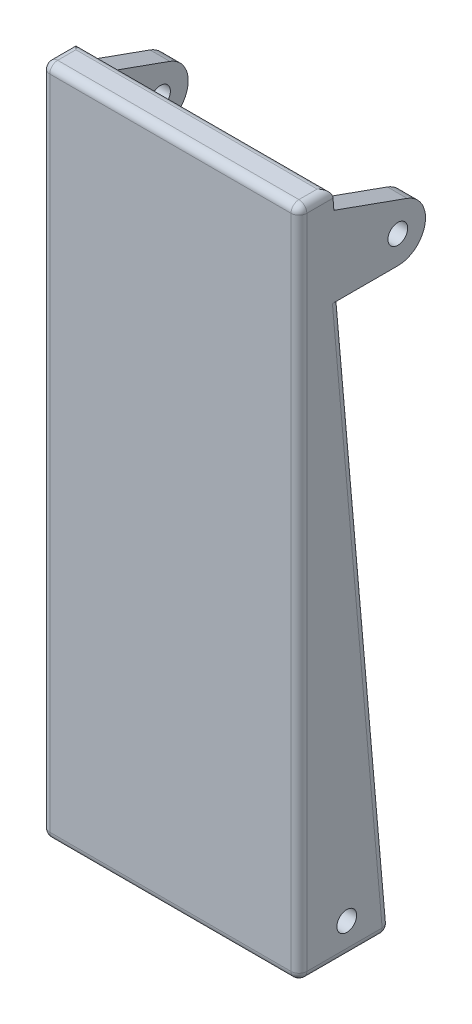
ISO-10303-21;
HEADER;
FILE_DESCRIPTION(('STEP AP214'),'2;1');
FILE_NAME('part.step','',(''),(''),'','','');
FILE_SCHEMA(('AUTOMOTIVE_DESIGN { 1 0 10303 214 1 1 1 1 }'));
ENDSEC;
DATA;
#1=APPLICATION_CONTEXT('core data for automotive mechanical design processes');
#2=APPLICATION_PROTOCOL_DEFINITION('international standard','automotive_design',2000,#1);
#3=PRODUCT_CONTEXT('',#1,'mechanical');
#4=PRODUCT('Part','Part','',(#3));
#5=PRODUCT_RELATED_PRODUCT_CATEGORY('part','',(#4));
#6=PRODUCT_DEFINITION_FORMATION('','',#4);
#7=PRODUCT_DEFINITION_CONTEXT('part definition',#1,'design');
#8=PRODUCT_DEFINITION('design','',#6,#7);
#9=PRODUCT_DEFINITION_SHAPE('','',#8);
#10=(LENGTH_UNIT() NAMED_UNIT(*) SI_UNIT(.MILLI.,.METRE.));
#11=(NAMED_UNIT(*) PLANE_ANGLE_UNIT() SI_UNIT($,.RADIAN.));
#12=(NAMED_UNIT(*) SI_UNIT($,.STERADIAN.) SOLID_ANGLE_UNIT());
#13=UNCERTAINTY_MEASURE_WITH_UNIT(LENGTH_MEASURE(1.E-05),#10,'distance_accuracy_value','');
#14=(GEOMETRIC_REPRESENTATION_CONTEXT(3) GLOBAL_UNCERTAINTY_ASSIGNED_CONTEXT((#13)) GLOBAL_UNIT_ASSIGNED_CONTEXT((#10,
#11,#12)) REPRESENTATION_CONTEXT('',''));
#15=CARTESIAN_POINT('',(0.,0.,0.));
#16=DIRECTION('',(0.,0.,1.));
#17=DIRECTION('',(1.,0.,0.));
#18=AXIS2_PLACEMENT_3D('',#15,#16,#17);
#19=CARTESIAN_POINT('',(0.,8.,22.9120816198795));
#20=DIRECTION('',(1.,0.,0.));
#21=DIRECTION('',(0.,0.,-1.));
#22=AXIS2_PLACEMENT_3D('',#19,#20,#21);
#23=CYLINDRICAL_SURFACE('',#22,2.5);
#24=CARTESIAN_POINT('',(0.,8.,22.9120816198795));
#25=DIRECTION('',(1.,0.,0.));
#26=DIRECTION('',(0.,0.,-1.));
#27=AXIS2_PLACEMENT_3D('',#24,#25,#26);
#28=CIRCLE('',#27,2.5);
#29=CARTESIAN_POINT('',(0.,8.,20.4120816198795));
#30=VERTEX_POINT('',#29);
#31=EDGE_CURVE('E282',#30,#30,#28,.T.);
#32=ORIENTED_EDGE('',*,*,#31,.F.);
#33=EDGE_LOOP('',(#32));
#34=FACE_BOUND('',#33,.T.);
#35=CARTESIAN_POINT('',(7.5,8.,22.9120816198795));
#36=DIRECTION('',(1.,0.,0.));
#37=DIRECTION('',(0.,0.,-1.));
#38=AXIS2_PLACEMENT_3D('',#35,#36,#37);
#39=CIRCLE('',#38,2.5);
#40=CARTESIAN_POINT('',(7.5,8.,20.4120816198795));
#41=VERTEX_POINT('',#40);
#42=EDGE_CURVE('E228',#41,#41,#39,.F.);
#43=ORIENTED_EDGE('',*,*,#42,.F.);
#44=EDGE_LOOP('',(#43));
#45=FACE_BOUND('',#44,.T.);
#46=ADVANCED_FACE('F41',(#34,#45),#23,.F.);
#47=CARTESIAN_POINT('',(0.,152.,10.));
#48=DIRECTION('',(1.,0.,0.));
#49=DIRECTION('',(0.,0.,-1.));
#50=AXIS2_PLACEMENT_3D('',#47,#48,#49);
#51=CYLINDRICAL_SURFACE('',#50,7.00000000000001);
#52=DIRECTION('',(1.,0.,0.));
#53=VECTOR('',#52,1.);
#54=CARTESIAN_POINT('',(0.,145.,10.));
#55=LINE('',#54,#53);
#56=CARTESIAN_POINT('',(60.,145.,10.));
#57=VERTEX_POINT('',#56);
#58=CARTESIAN_POINT('',(65.,145.,10.));
#59=VERTEX_POINT('',#58);
#60=EDGE_CURVE('E304',#57,#59,#55,.T.);
#61=ORIENTED_EDGE('',*,*,#60,.F.);
#62=CARTESIAN_POINT('',(60.,152.,10.));
#63=DIRECTION('',(-1.,0.,0.));
#64=DIRECTION('',(0.,0.,1.));
#65=AXIS2_PLACEMENT_3D('',#62,#63,#64);
#66=CIRCLE('',#65,7.00000000000001);
#67=CARTESIAN_POINT('',(60.,158.589386816768,7.63780157924638));
#68=VERTEX_POINT('',#67);
#69=EDGE_CURVE('E272',#57,#68,#66,.F.);
#70=ORIENTED_EDGE('',*,*,#69,.T.);
#71=DIRECTION('',(1.,0.,0.));
#72=VECTOR('',#71,1.);
#73=CARTESIAN_POINT('',(0.,158.589386816768,7.63780157924638));
#74=LINE('',#73,#72);
#75=CARTESIAN_POINT('',(65.,158.589386816768,7.63780157924638));
#76=VERTEX_POINT('',#75);
#77=EDGE_CURVE('E319',#68,#76,#74,.T.);
#78=ORIENTED_EDGE('',*,*,#77,.T.);
#79=CARTESIAN_POINT('',(65.,152.,10.));
#80=DIRECTION('',(1.,0.,0.));
#81=DIRECTION('',(0.,0.,-1.));
#82=AXIS2_PLACEMENT_3D('',#79,#80,#81);
#83=CIRCLE('',#82,7.00000000000001);
#84=EDGE_CURVE('E291',#59,#76,#83,.T.);
#85=ORIENTED_EDGE('',*,*,#84,.F.);
#86=EDGE_LOOP('',(#61,#70,#78,#85));
#87=FACE_BOUND('',#86,.T.);
#88=ADVANCED_FACE('F545',(#87),#51,.T.);
#89=CARTESIAN_POINT('',(0.,138.103436593652,-49.5080542232011));
#90=DIRECTION('',(0.,0.941340973823926,-0.337456917250517));
#91=DIRECTION('',(0.,0.337456917250517,0.941340973823926));
#92=AXIS2_PLACEMENT_3D('',#89,#90,#91);
#93=PLANE('',#92);
#94=ORIENTED_EDGE('',*,*,#77,.F.);
#95=DIRECTION('',(0.,0.337456917250517,0.941340973823926));
#96=VECTOR('',#95,1.);
#97=CARTESIAN_POINT('',(60.,138.103436593652,-49.5080542232011));
#98=LINE('',#97,#96);
#99=CARTESIAN_POINT('',(60.,165.225967095796,26.1506386952323));
#100=VERTEX_POINT('',#99);
#101=EDGE_CURVE('E275',#68,#100,#98,.T.);
#102=ORIENTED_EDGE('',*,*,#101,.T.);
#103=DIRECTION('',(-1.,0.,0.));
#104=VECTOR('',#103,1.);
#105=CARTESIAN_POINT('',(0.,165.225967095796,26.1506386952323));
#106=LINE('',#105,#104);
#107=CARTESIAN_POINT('',(5.00000000000002,165.225967095796,26.1506386952323));
#108=VERTEX_POINT('',#107);
#109=EDGE_CURVE('E278',#100,#108,#106,.T.);
#110=ORIENTED_EDGE('',*,*,#109,.T.);
#111=DIRECTION('',(0.,0.337456917250517,0.941340973823926));
#112=VECTOR('',#111,1.);
#113=CARTESIAN_POINT('',(5.00000000000001,138.103436593652,-49.5080542232011));
#114=LINE('',#113,#112);
#115=CARTESIAN_POINT('',(5.00000000000001,158.589386816768,7.63780157924638));
#116=VERTEX_POINT('',#115);
#117=EDGE_CURVE('E267',#116,#108,#114,.T.);
#118=ORIENTED_EDGE('',*,*,#117,.F.);
#119=CARTESIAN_POINT('',(0.,158.589386816768,7.63780157924638));
#120=VERTEX_POINT('',#119);
#121=EDGE_CURVE('E315',#120,#116,#74,.T.);
#122=ORIENTED_EDGE('',*,*,#121,.F.);
#123=DIRECTION('',(0.,0.337456917250517,0.941340973823926));
#124=VECTOR('',#123,1.);
#125=CARTESIAN_POINT('',(0.,138.103436593652,-49.5080542232011));
#126=LINE('',#125,#124);
#127=CARTESIAN_POINT('',(0.,165.230959028457,26.1645637639203));
#128=VERTEX_POINT('',#127);
#129=EDGE_CURVE('E302',#120,#128,#126,.T.);
#130=ORIENTED_EDGE('',*,*,#129,.T.);
#131=DIRECTION('',(1.,0.,0.));
#132=VECTOR('',#131,1.);
#133=CARTESIAN_POINT('',(0.,165.230959028457,26.1645637639203));
#134=LINE('',#133,#132);
#135=CARTESIAN_POINT('',(65.,165.230959028457,26.1645637639203));
#136=VERTEX_POINT('',#135);
#137=EDGE_CURVE('E320',#128,#136,#134,.T.);
#138=ORIENTED_EDGE('',*,*,#137,.T.);
#139=DIRECTION('',(0.,0.337456917250517,0.941340973823926));
#140=VECTOR('',#139,1.);
#141=CARTESIAN_POINT('',(65.,138.103436593652,-49.5080542232011));
#142=LINE('',#141,#140);
#143=EDGE_CURVE('E297',#76,#136,#142,.T.);
#144=ORIENTED_EDGE('',*,*,#143,.F.);
#145=EDGE_LOOP('',(#94,#102,#110,#118,#122,#130,#138,#144));
#146=FACE_BOUND('',#145,.T.);
#147=ADVANCED_FACE('F549',(#146),#93,.T.);
#148=CARTESIAN_POINT('',(0.,145.,0.));
#149=DIRECTION('',(0.,1.,0.));
#150=DIRECTION('',(0.,0.,1.));
#151=AXIS2_PLACEMENT_3D('',#148,#149,#150);
#152=PLANE('',#151);
#153=DIRECTION('',(0.,0.,1.));
#154=VECTOR('',#153,1.);
#155=CARTESIAN_POINT('',(60.,145.,0.));
#156=LINE('',#155,#154);
#157=CARTESIAN_POINT('',(60.,145.,24.3959473230592));
#158=VERTEX_POINT('',#157);
#159=EDGE_CURVE('E270',#57,#158,#156,.T.);
#160=ORIENTED_EDGE('',*,*,#159,.F.);
#161=ORIENTED_EDGE('',*,*,#60,.T.);
#162=DIRECTION('',(0.,0.,1.));
#163=VECTOR('',#162,1.);
#164=CARTESIAN_POINT('',(65.,145.,0.));
#165=LINE('',#164,#163);
#166=CARTESIAN_POINT('',(65.,145.,26.5316202749914));
#167=VERTEX_POINT('',#166);
#168=EDGE_CURVE('E307',#59,#167,#165,.T.);
#169=ORIENTED_EDGE('',*,*,#168,.T.);
#170=CARTESIAN_POINT('',(63.,145.,26.5316202749914));
#171=DIRECTION('',(0.,1.,0.));
#172=DIRECTION('',(0.,0.,-1.));
#173=AXIS2_PLACEMENT_3D('',#170,#171,#172);
#174=ELLIPSE('',#173,2.00771096744018,2.);
#175=CARTESIAN_POINT('',(63.,145.,24.5239093075512));
#176=VERTEX_POINT('',#175);
#177=EDGE_CURVE('E391',#167,#176,#174,.T.);
#178=ORIENTED_EDGE('',*,*,#177,.T.);
#179=DIRECTION('',(1.,0.,0.));
#180=VECTOR('',#179,1.);
#181=CARTESIAN_POINT('',(0.,145.,24.5239093075512));
#182=LINE('',#181,#180);
#183=CARTESIAN_POINT('',(2.,145.,24.5239093075512));
#184=VERTEX_POINT('',#183);
#185=EDGE_CURVE('E322',#184,#176,#182,.T.);
#186=ORIENTED_EDGE('',*,*,#185,.F.);
#187=CARTESIAN_POINT('',(2.,145.,26.5316202749914));
#188=DIRECTION('',(0.,1.,0.));
#189=DIRECTION('',(0.,0.,-1.));
#190=AXIS2_PLACEMENT_3D('',#187,#188,#189);
#191=ELLIPSE('',#190,2.00771096744018,2.);
#192=CARTESIAN_POINT('',(0.,145.,26.5316202749914));
#193=VERTEX_POINT('',#192);
#194=EDGE_CURVE('E388',#184,#193,#191,.T.);
#195=ORIENTED_EDGE('',*,*,#194,.T.);
#196=DIRECTION('',(0.,0.,1.));
#197=VECTOR('',#196,1.);
#198=CARTESIAN_POINT('',(0.,145.,0.));
#199=LINE('',#198,#197);
#200=CARTESIAN_POINT('',(0.,145.,10.));
#201=VERTEX_POINT('',#200);
#202=EDGE_CURVE('E296',#201,#193,#199,.T.);
#203=ORIENTED_EDGE('',*,*,#202,.F.);
#204=CARTESIAN_POINT('',(5.00000000000001,145.,10.));
#205=VERTEX_POINT('',#204);
#206=EDGE_CURVE('E325',#201,#205,#55,.T.);
#207=ORIENTED_EDGE('',*,*,#206,.T.);
#208=DIRECTION('',(0.,0.,1.));
#209=VECTOR('',#208,1.);
#210=CARTESIAN_POINT('',(5.00000000000001,145.,0.));
#211=LINE('',#210,#209);
#212=CARTESIAN_POINT('',(5.00000000000001,145.,24.3959473230592));
#213=VERTEX_POINT('',#212);
#214=EDGE_CURVE('E262',#205,#213,#211,.T.);
#215=ORIENTED_EDGE('',*,*,#214,.T.);
#216=DIRECTION('',(-1.,0.,0.));
#217=VECTOR('',#216,1.);
#218=CARTESIAN_POINT('',(0.,145.,24.3959473230592));
#219=LINE('',#218,#217);
#220=EDGE_CURVE('E318',#158,#213,#219,.T.);
#221=ORIENTED_EDGE('',*,*,#220,.F.);
#222=EDGE_LOOP('',(#160,#161,#169,#178,#186,#195,#203,#207,#215,#221));
#223=FACE_BOUND('',#222,.T.);
#224=ADVANCED_FACE('F534',(#223),#152,.F.);
#225=CARTESIAN_POINT('',(0.,152.,10.));
#226=DIRECTION('',(1.,0.,0.));
#227=DIRECTION('',(0.,0.,-1.));
#228=AXIS2_PLACEMENT_3D('',#225,#226,#227);
#229=CYLINDRICAL_SURFACE('',#228,2.5);
#230=CARTESIAN_POINT('',(65.,152.,10.));
#231=DIRECTION('',(1.,0.,0.));
#232=DIRECTION('',(0.,0.,-1.));
#233=AXIS2_PLACEMENT_3D('',#230,#231,#232);
#234=CIRCLE('',#233,2.5);
#235=CARTESIAN_POINT('',(65.,152.,7.5));
#236=VERTEX_POINT('',#235);
#237=EDGE_CURVE('E285',#236,#236,#234,.T.);
#238=ORIENTED_EDGE('',*,*,#237,.T.);
#239=EDGE_LOOP('',(#238));
#240=FACE_BOUND('',#239,.T.);
#241=CARTESIAN_POINT('',(60.,152.,10.));
#242=DIRECTION('',(-1.,0.,0.));
#243=DIRECTION('',(0.,0.,1.));
#244=AXIS2_PLACEMENT_3D('',#241,#242,#243);
#245=CIRCLE('',#244,2.5);
#246=CARTESIAN_POINT('',(60.,152.,12.5));
#247=VERTEX_POINT('',#246);
#248=EDGE_CURVE('E269',#247,#247,#245,.F.);
#249=ORIENTED_EDGE('',*,*,#248,.F.);
#250=EDGE_LOOP('',(#249));
#251=FACE_BOUND('',#250,.T.);
#252=ADVANCED_FACE('F607',(#240,#251),#229,.F.);
#253=CARTESIAN_POINT('',(65.,0.,35.));
#254=DIRECTION('',(-1.,0.,0.));
#255=DIRECTION('',(0.,0.,1.));
#256=AXIS2_PLACEMENT_3D('',#253,#254,#255);
#257=PLANE('',#256);
#258=CARTESIAN_POINT('',(65.,8.,22.9120816198795));
#259=DIRECTION('',(1.,0.,0.));
#260=DIRECTION('',(0.,0.,-1.));
#261=AXIS2_PLACEMENT_3D('',#258,#259,#260);
#262=CIRCLE('',#261,2.5);
#263=CARTESIAN_POINT('',(65.,8.,20.4120816198795));
#264=VERTEX_POINT('',#263);
#265=EDGE_CURVE('E281',#264,#264,#262,.T.);
#266=ORIENTED_EDGE('',*,*,#265,.F.);
#267=EDGE_LOOP('',(#266));
#268=FACE_BOUND('',#267,.T.);
#269=ORIENTED_EDGE('',*,*,#237,.F.);
#270=EDGE_LOOP('',(#269));
#271=FACE_BOUND('',#270,.T.);
#272=DIRECTION('',(0.,1.,0.));
#273=VECTOR('',#272,1.);
#274=CARTESIAN_POINT('',(65.,0.,33.));
#275=LINE('',#274,#273);
#276=CARTESIAN_POINT('',(65.,168.,33.));
#277=VERTEX_POINT('',#276);
#278=CARTESIAN_POINT('',(65.,2.,33.));
#279=VERTEX_POINT('',#278);
#280=EDGE_CURVE('E356',#277,#279,#275,.F.);
#281=ORIENTED_EDGE('',*,*,#280,.T.);
#282=DIRECTION('',(0.,0.,-1.));
#283=VECTOR('',#282,1.);
#284=CARTESIAN_POINT('',(65.,2.,35.));
#285=LINE('',#284,#283);
#286=CARTESIAN_POINT('',(65.,2.,13.9623902845195));
#287=VERTEX_POINT('',#286);
#288=EDGE_CURVE('E435',#279,#287,#285,.T.);
#289=ORIENTED_EDGE('',*,*,#288,.T.);
#290=DIRECTION('',(0.,-0.996159323943919,-0.0875591304182109));
#291=VECTOR('',#290,1.);
#292=CARTESIAN_POINT('',(65.,1.85029335640451,13.9492315626002));
#293=LINE('',#292,#291);
#294=EDGE_CURVE('E362',#287,#167,#293,.F.);
#295=ORIENTED_EDGE('',*,*,#294,.T.);
#296=ORIENTED_EDGE('',*,*,#168,.F.);
#297=ORIENTED_EDGE('',*,*,#84,.T.);
#298=ORIENTED_EDGE('',*,*,#143,.T.);
#299=DIRECTION('',(0.,0.996727831925168,0.0808308670357637));
#300=VECTOR('',#299,1.);
#301=CARTESIAN_POINT('',(65.,-1.02842625560353,12.6815548271812));
#302=LINE('',#301,#300);
#303=CARTESIAN_POINT('',(65.,168.,26.3891225405676));
#304=VERTEX_POINT('',#303);
#305=EDGE_CURVE('E310',#136,#304,#302,.T.);
#306=ORIENTED_EDGE('',*,*,#305,.T.);
#307=DIRECTION('',(0.,0.,-1.));
#308=VECTOR('',#307,1.);
#309=CARTESIAN_POINT('',(65.,168.,35.));
#310=LINE('',#309,#308);
#311=EDGE_CURVE('E359',#304,#277,#310,.F.);
#312=ORIENTED_EDGE('',*,*,#311,.T.);
#313=EDGE_LOOP('',(#281,#289,#295,#296,#297,#298,#306,#312));
#314=FACE_BOUND('',#313,.T.);
#315=ADVANCED_FACE('F485',(#268,#271,#314),#257,.F.);
#316=CARTESIAN_POINT('',(0.,170.,35.));
#317=DIRECTION('',(0.,-1.,0.));
#318=DIRECTION('',(0.,0.,-1.));
#319=AXIS2_PLACEMENT_3D('',#316,#317,#318);
#320=PLANE('',#319);
#321=DIRECTION('',(0.,0.,-1.));
#322=VECTOR('',#321,1.);
#323=CARTESIAN_POINT('',(63.,170.,35.));
#324=LINE('',#323,#322);
#325=CARTESIAN_POINT('',(63.,170.,33.));
#326=VERTEX_POINT('',#325);
#327=CARTESIAN_POINT('',(63.,170.,28.3956883611859));
#328=VERTEX_POINT('',#327);
#329=EDGE_CURVE('E345',#326,#328,#324,.T.);
#330=ORIENTED_EDGE('',*,*,#329,.T.);
#331=DIRECTION('',(1.,0.,0.));
#332=VECTOR('',#331,1.);
#333=CARTESIAN_POINT('',(0.,170.,28.3956883611859));
#334=LINE('',#333,#332);
#335=CARTESIAN_POINT('',(2.,170.,28.3956883611859));
#336=VERTEX_POINT('',#335);
#337=EDGE_CURVE('E348',#328,#336,#334,.F.);
#338=ORIENTED_EDGE('',*,*,#337,.T.);
#339=DIRECTION('',(0.,0.,-1.));
#340=VECTOR('',#339,1.);
#341=CARTESIAN_POINT('',(2.,170.,35.));
#342=LINE('',#341,#340);
#343=CARTESIAN_POINT('',(2.,170.,33.));
#344=VERTEX_POINT('',#343);
#345=EDGE_CURVE('E343',#336,#344,#342,.F.);
#346=ORIENTED_EDGE('',*,*,#345,.T.);
#347=DIRECTION('',(-1.,0.,0.));
#348=VECTOR('',#347,1.);
#349=CARTESIAN_POINT('',(65.,170.,33.));
#350=LINE('',#349,#348);
#351=EDGE_CURVE('E341',#344,#326,#350,.F.);
#352=ORIENTED_EDGE('',*,*,#351,.T.);
#353=EDGE_LOOP('',(#330,#338,#346,#352));
#354=FACE_BOUND('',#353,.T.);
#355=ADVANCED_FACE('F564',(#354),#320,.F.);
#356=CARTESIAN_POINT('',(0.,0.,35.));
#357=DIRECTION('',(1.,0.,0.));
#358=DIRECTION('',(0.,0.,-1.));
#359=AXIS2_PLACEMENT_3D('',#356,#357,#358);
#360=PLANE('',#359);
#361=ORIENTED_EDGE('',*,*,#31,.T.);
#362=EDGE_LOOP('',(#361));
#363=FACE_BOUND('',#362,.T.);
#364=CARTESIAN_POINT('',(0.,152.,10.));
#365=DIRECTION('',(1.,0.,0.));
#366=DIRECTION('',(0.,0.,-1.));
#367=AXIS2_PLACEMENT_3D('',#364,#365,#366);
#368=CIRCLE('',#367,2.5);
#369=CARTESIAN_POINT('',(0.,152.,7.5));
#370=VERTEX_POINT('',#369);
#371=EDGE_CURVE('E288',#370,#370,#368,.T.);
#372=ORIENTED_EDGE('',*,*,#371,.T.);
#373=EDGE_LOOP('',(#372));
#374=FACE_BOUND('',#373,.T.);
#375=DIRECTION('',(0.,-0.996159323943919,-0.0875591304182109));
#376=VECTOR('',#375,1.);
#377=CARTESIAN_POINT('',(0.,1.85029335640451,13.9492315626002));
#378=LINE('',#377,#376);
#379=CARTESIAN_POINT('',(0.,2.,13.9623902845194));
#380=VERTEX_POINT('',#379);
#381=EDGE_CURVE('E368',#193,#380,#378,.T.);
#382=ORIENTED_EDGE('',*,*,#381,.T.);
#383=DIRECTION('',(0.,0.,-1.));
#384=VECTOR('',#383,1.);
#385=CARTESIAN_POINT('',(0.,2.,35.));
#386=LINE('',#385,#384);
#387=CARTESIAN_POINT('',(0.,2.,33.));
#388=VERTEX_POINT('',#387);
#389=EDGE_CURVE('E428',#380,#388,#386,.F.);
#390=ORIENTED_EDGE('',*,*,#389,.T.);
#391=DIRECTION('',(0.,-1.,0.));
#392=VECTOR('',#391,1.);
#393=CARTESIAN_POINT('',(0.,170.,33.));
#394=LINE('',#393,#392);
#395=CARTESIAN_POINT('',(0.,168.,33.));
#396=VERTEX_POINT('',#395);
#397=EDGE_CURVE('E364',#388,#396,#394,.F.);
#398=ORIENTED_EDGE('',*,*,#397,.T.);
#399=DIRECTION('',(0.,0.,-1.));
#400=VECTOR('',#399,1.);
#401=CARTESIAN_POINT('',(0.,168.,35.));
#402=LINE('',#401,#400);
#403=CARTESIAN_POINT('',(0.,168.,26.3891225405676));
#404=VERTEX_POINT('',#403);
#405=EDGE_CURVE('E366',#396,#404,#402,.T.);
#406=ORIENTED_EDGE('',*,*,#405,.T.);
#407=DIRECTION('',(0.,0.996727831925168,0.0808308670357637));
#408=VECTOR('',#407,1.);
#409=CARTESIAN_POINT('',(0.,-1.02842625560353,12.6815548271812));
#410=LINE('',#409,#408);
#411=EDGE_CURVE('E299',#128,#404,#410,.T.);
#412=ORIENTED_EDGE('',*,*,#411,.F.);
#413=ORIENTED_EDGE('',*,*,#129,.F.);
#414=CARTESIAN_POINT('',(0.,152.,10.));
#415=DIRECTION('',(1.,0.,0.));
#416=DIRECTION('',(0.,0.,-1.));
#417=AXIS2_PLACEMENT_3D('',#414,#415,#416);
#418=CIRCLE('',#417,7.00000000000001);
#419=EDGE_CURVE('E294',#201,#120,#418,.T.);
#420=ORIENTED_EDGE('',*,*,#419,.F.);
#421=ORIENTED_EDGE('',*,*,#202,.T.);
#422=EDGE_LOOP('',(#382,#390,#398,#406,#412,#413,#420,#421));
#423=FACE_BOUND('',#422,.T.);
#424=ADVANCED_FACE('F526',(#363,#374,#423),#360,.F.);
#425=CARTESIAN_POINT('',(0.,0.,35.));
#426=DIRECTION('',(0.,1.,0.));
#427=DIRECTION('',(0.,0.,1.));
#428=AXIS2_PLACEMENT_3D('',#425,#426,#427);
#429=PLANE('',#428);
#430=DIRECTION('',(1.,0.,0.));
#431=VECTOR('',#430,1.);
#432=CARTESIAN_POINT('',(0.,0.,33.));
#433=LINE('',#432,#431);
#434=CARTESIAN_POINT('',(63.,0.,33.));
#435=VERTEX_POINT('',#434);
#436=CARTESIAN_POINT('',(2.,0.,33.));
#437=VERTEX_POINT('',#436);
#438=EDGE_CURVE('E382',#435,#437,#433,.F.);
#439=ORIENTED_EDGE('',*,*,#438,.T.);
#440=DIRECTION('',(0.,0.,-1.));
#441=VECTOR('',#440,1.);
#442=CARTESIAN_POINT('',(2.,0.,35.));
#443=LINE('',#442,#441);
#444=CARTESIAN_POINT('',(2.,0.,13.9623902845194));
#445=VERTEX_POINT('',#444);
#446=EDGE_CURVE('E426',#437,#445,#443,.T.);
#447=ORIENTED_EDGE('',*,*,#446,.T.);
#448=DIRECTION('',(1.,0.,0.));
#449=VECTOR('',#448,1.);
#450=CARTESIAN_POINT('',(0.,0.,13.9623902845194));
#451=LINE('',#450,#449);
#452=CARTESIAN_POINT('',(7.5,0.,13.9623902845194));
#453=VERTEX_POINT('',#452);
#454=EDGE_CURVE('E241',#445,#453,#451,.T.);
#455=ORIENTED_EDGE('',*,*,#454,.T.);
#456=DIRECTION('',(0.,0.,-1.));
#457=VECTOR('',#456,1.);
#458=CARTESIAN_POINT('',(7.5,0.,31.5176418291938));
#459=LINE('',#458,#457);
#460=CARTESIAN_POINT('',(7.5,0.,31.5176418291938));
#461=VERTEX_POINT('',#460);
#462=EDGE_CURVE('E232',#461,#453,#459,.T.);
#463=ORIENTED_EDGE('',*,*,#462,.F.);
#464=DIRECTION('',(-1.,0.,0.));
#465=VECTOR('',#464,1.);
#466=CARTESIAN_POINT('',(57.5,0.,31.5176418291938));
#467=LINE('',#466,#465);
#468=CARTESIAN_POINT('',(57.5,0.,31.5176418291938));
#469=VERTEX_POINT('',#468);
#470=EDGE_CURVE('E218',#469,#461,#467,.T.);
#471=ORIENTED_EDGE('',*,*,#470,.F.);
#472=DIRECTION('',(0.,0.,-1.));
#473=VECTOR('',#472,1.);
#474=CARTESIAN_POINT('',(57.5,0.,31.5176418291938));
#475=LINE('',#474,#473);
#476=CARTESIAN_POINT('',(57.5,0.,13.9623902845194));
#477=VERTEX_POINT('',#476);
#478=EDGE_CURVE('E246',#469,#477,#475,.T.);
#479=ORIENTED_EDGE('',*,*,#478,.T.);
#480=DIRECTION('',(1.,0.,0.));
#481=VECTOR('',#480,1.);
#482=CARTESIAN_POINT('',(0.,0.,13.9623902845194));
#483=LINE('',#482,#481);
#484=CARTESIAN_POINT('',(63.,0.,13.9623902845194));
#485=VERTEX_POINT('',#484);
#486=EDGE_CURVE('E421',#477,#485,#483,.T.);
#487=ORIENTED_EDGE('',*,*,#486,.T.);
#488=DIRECTION('',(0.,0.,-1.));
#489=VECTOR('',#488,1.);
#490=CARTESIAN_POINT('',(63.,0.,35.));
#491=LINE('',#490,#489);
#492=EDGE_CURVE('E423',#485,#435,#491,.F.);
#493=ORIENTED_EDGE('',*,*,#492,.T.);
#494=EDGE_LOOP('',(#439,#447,#455,#463,#471,#479,#487,#493));
#495=FACE_BOUND('',#494,.T.);
#496=ADVANCED_FACE('F239',(#495),#429,.F.);
#497=CARTESIAN_POINT('',(0.,0.,35.));
#498=DIRECTION('',(0.,0.,1.));
#499=DIRECTION('',(1.,0.,0.));
#500=AXIS2_PLACEMENT_3D('',#497,#498,#499);
#501=PLANE('',#500);
#502=DIRECTION('',(-1.,0.,0.));
#503=VECTOR('',#502,1.);
#504=CARTESIAN_POINT('',(0.,168.,35.));
#505=LINE('',#504,#503);
#506=CARTESIAN_POINT('',(63.,168.,35.));
#507=VERTEX_POINT('',#506);
#508=CARTESIAN_POINT('',(2.,168.,35.));
#509=VERTEX_POINT('',#508);
#510=EDGE_CURVE('E376',#507,#509,#505,.T.);
#511=ORIENTED_EDGE('',*,*,#510,.T.);
#512=DIRECTION('',(0.,-1.,0.));
#513=VECTOR('',#512,1.);
#514=CARTESIAN_POINT('',(2.,0.,35.));
#515=LINE('',#514,#513);
#516=CARTESIAN_POINT('',(2.,2.,35.));
#517=VERTEX_POINT('',#516);
#518=EDGE_CURVE('E379',#509,#517,#515,.T.);
#519=ORIENTED_EDGE('',*,*,#518,.T.);
#520=DIRECTION('',(1.,0.,0.));
#521=VECTOR('',#520,1.);
#522=CARTESIAN_POINT('',(65.,2.,35.));
#523=LINE('',#522,#521);
#524=CARTESIAN_POINT('',(63.,2.,35.));
#525=VERTEX_POINT('',#524);
#526=EDGE_CURVE('E373',#517,#525,#523,.T.);
#527=ORIENTED_EDGE('',*,*,#526,.T.);
#528=DIRECTION('',(0.,1.,0.));
#529=VECTOR('',#528,1.);
#530=CARTESIAN_POINT('',(63.,170.,35.));
#531=LINE('',#530,#529);
#532=EDGE_CURVE('E371',#525,#507,#531,.T.);
#533=ORIENTED_EDGE('',*,*,#532,.T.);
#534=EDGE_LOOP('',(#511,#519,#527,#533));
#535=FACE_BOUND('',#534,.T.);
#536=ADVANCED_FACE('F502',(#535),#501,.T.);
#537=CARTESIAN_POINT('',(5.00000000000001,152.,10.));
#538=DIRECTION('',(-1.,0.,0.));
#539=DIRECTION('',(0.,0.,1.));
#540=AXIS2_PLACEMENT_3D('',#537,#538,#539);
#541=CIRCLE('',#540,7.00000000000001);
#542=EDGE_CURVE('E265',#205,#116,#541,.F.);
#543=ORIENTED_EDGE('',*,*,#542,.F.);
#544=ORIENTED_EDGE('',*,*,#206,.F.);
#545=ORIENTED_EDGE('',*,*,#419,.T.);
#546=ORIENTED_EDGE('',*,*,#121,.T.);
#547=EDGE_LOOP('',(#543,#544,#545,#546));
#548=FACE_BOUND('',#547,.T.);
#549=ADVANCED_FACE('F591',(#548),#51,.T.);
#550=CARTESIAN_POINT('',(0.,-1.02842625560353,12.6815548271812));
#551=DIRECTION('',(0.,0.0808308670357636,-0.996727831925168));
#552=DIRECTION('',(0.,0.996727831925169,0.0808308670357637));
#553=AXIS2_PLACEMENT_3D('',#550,#551,#552);
#554=PLANE('',#553);
#555=DIRECTION('',(1.,0.,0.));
#556=VECTOR('',#555,1.);
#557=CARTESIAN_POINT('',(65.,168.161661734072,26.4022326973355));
#558=LINE('',#557,#556);
#559=CARTESIAN_POINT('',(0.00654433614966088,168.161661734072,26.4022326973355));
#560=VERTEX_POINT('',#559);
#561=CARTESIAN_POINT('',(64.9934556638503,168.161661734072,26.4022326973355));
#562=VERTEX_POINT('',#561);
#563=EDGE_CURVE('E350',#560,#562,#558,.T.);
#564=ORIENTED_EDGE('',*,*,#563,.T.);
#565=CARTESIAN_POINT('',(63.,168.,26.3891225405676));
#566=DIRECTION('',(0.,0.0808308670357636,-0.996727831925168));
#567=DIRECTION('',(0.,-0.996727831925169,-0.0808308670357637));
#568=AXIS2_PLACEMENT_3D('',#565,#566,#567);
#569=ELLIPSE('',#568,2.00656582061828,2.);
#570=EDGE_CURVE('E354',#562,#304,#569,.T.);
#571=ORIENTED_EDGE('',*,*,#570,.T.);
#572=ORIENTED_EDGE('',*,*,#305,.F.);
#573=ORIENTED_EDGE('',*,*,#137,.F.);
#574=ORIENTED_EDGE('',*,*,#411,.T.);
#575=CARTESIAN_POINT('',(2.,168.,26.3891225405676));
#576=DIRECTION('',(0.,0.0808308670357636,-0.996727831925168));
#577=DIRECTION('',(0.,-0.996727831925169,-0.0808308670357637));
#578=AXIS2_PLACEMENT_3D('',#575,#576,#577);
#579=ELLIPSE('',#578,2.00656582061828,2.);
#580=EDGE_CURVE('E352',#404,#560,#579,.T.);
#581=ORIENTED_EDGE('',*,*,#580,.T.);
#582=EDGE_LOOP('',(#564,#571,#572,#573,#574,#581));
#583=FACE_BOUND('',#582,.T.);
#584=ADVANCED_FACE('F554',(#583),#554,.T.);
#585=CARTESIAN_POINT('',(0.,-1.02738792844735,11.6885818685266));
#586=DIRECTION('',(0.,-0.0875591304182109,0.996159323943919));
#587=DIRECTION('',(0.,-0.996159323943919,-0.0875591304182109));
#588=AXIS2_PLACEMENT_3D('',#585,#586,#587);
#589=PLANE('',#588);
#590=DIRECTION('',(0.,0.996159323943919,0.0875591304182109));
#591=VECTOR('',#590,1.);
#592=CARTESIAN_POINT('',(7.5,-1.02738792844735,11.6885818685266));
#593=LINE('',#592,#591);
#594=CARTESIAN_POINT('',(7.5,2.17511826083642,11.9700716366316));
#595=VERTEX_POINT('',#594);
#596=CARTESIAN_POINT('',(7.5,31.6696301235391,14.5625422873939));
#597=VERTEX_POINT('',#596);
#598=EDGE_CURVE('E251',#595,#597,#593,.T.);
#599=ORIENTED_EDGE('',*,*,#598,.F.);
#600=DIRECTION('',(1.,0.,0.));
#601=VECTOR('',#600,1.);
#602=CARTESIAN_POINT('',(0.,2.17511826083642,11.9700716366316));
#603=LINE('',#602,#601);
#604=CARTESIAN_POINT('',(2.,2.17511826083642,11.9700716366316));
#605=VERTEX_POINT('',#604);
#606=EDGE_CURVE('E50',#595,#605,#603,.F.);
#607=ORIENTED_EDGE('',*,*,#606,.T.);
#608=DIRECTION('',(0.,-0.996159323943919,-0.0875591304182109));
#609=VECTOR('',#608,1.);
#610=CARTESIAN_POINT('',(2.,-1.02738792844735,11.6885818685266));
#611=LINE('',#610,#609);
#612=EDGE_CURVE('E386',#605,#184,#611,.F.);
#613=ORIENTED_EDGE('',*,*,#612,.T.);
#614=ORIENTED_EDGE('',*,*,#185,.T.);
#615=DIRECTION('',(0.,-0.996159323943919,-0.0875591304182109));
#616=VECTOR('',#615,1.);
#617=CARTESIAN_POINT('',(63.,-1.02738792844735,11.6885818685266));
#618=LINE('',#617,#616);
#619=CARTESIAN_POINT('',(63.,2.17511826083642,11.9700716366316));
#620=VERTEX_POINT('',#619);
#621=EDGE_CURVE('E384',#176,#620,#618,.T.);
#622=ORIENTED_EDGE('',*,*,#621,.T.);
#623=DIRECTION('',(1.,0.,0.));
#624=VECTOR('',#623,1.);
#625=CARTESIAN_POINT('',(0.,2.17511826083642,11.9700716366316));
#626=LINE('',#625,#624);
#627=CARTESIAN_POINT('',(57.5,2.17511826083642,11.9700716366316));
#628=VERTEX_POINT('',#627);
#629=EDGE_CURVE('E58',#620,#628,#626,.F.);
#630=ORIENTED_EDGE('',*,*,#629,.T.);
#631=DIRECTION('',(0.,0.996159323943919,0.0875591304182109));
#632=VECTOR('',#631,1.);
#633=CARTESIAN_POINT('',(57.5,-1.02738792844735,11.6885818685266));
#634=LINE('',#633,#632);
#635=CARTESIAN_POINT('',(57.5,31.6696301235391,14.5625422873939));
#636=VERTEX_POINT('',#635);
#637=EDGE_CURVE('E254',#628,#636,#634,.T.);
#638=ORIENTED_EDGE('',*,*,#637,.T.);
#639=DIRECTION('',(1.,0.,0.));
#640=VECTOR('',#639,1.);
#641=CARTESIAN_POINT('',(0.,31.6696301235391,14.5625422873939));
#642=LINE('',#641,#640);
#643=EDGE_CURVE('E334',#597,#636,#642,.T.);
#644=ORIENTED_EDGE('',*,*,#643,.F.);
#645=EDGE_LOOP('',(#599,#607,#613,#614,#622,#630,#638,#644));
#646=FACE_BOUND('',#645,.T.);
#647=ADVANCED_FACE('F537',(#646),#589,.F.);
#648=CARTESIAN_POINT('',(5.00000000000001,152.,10.));
#649=DIRECTION('',(-1.,0.,0.));
#650=DIRECTION('',(0.,0.,1.));
#651=AXIS2_PLACEMENT_3D('',#648,#649,#650);
#652=CIRCLE('',#651,2.5);
#653=CARTESIAN_POINT('',(5.00000000000001,152.,12.5));
#654=VERTEX_POINT('',#653);
#655=EDGE_CURVE('E261',#654,#654,#652,.F.);
#656=ORIENTED_EDGE('',*,*,#655,.T.);
#657=EDGE_LOOP('',(#656));
#658=FACE_BOUND('',#657,.T.);
#659=ORIENTED_EDGE('',*,*,#371,.F.);
#660=EDGE_LOOP('',(#659));
#661=FACE_BOUND('',#660,.T.);
#662=ADVANCED_FACE('F598',(#658,#661),#229,.F.);
#663=CARTESIAN_POINT('',(57.5,8.,22.9120816198795));
#664=DIRECTION('',(1.,0.,0.));
#665=DIRECTION('',(0.,0.,-1.));
#666=AXIS2_PLACEMENT_3D('',#663,#664,#665);
#667=CIRCLE('',#666,2.5);
#668=CARTESIAN_POINT('',(57.5,8.,20.4120816198795));
#669=VERTEX_POINT('',#668);
#670=EDGE_CURVE('E253',#669,#669,#667,.F.);
#671=ORIENTED_EDGE('',*,*,#670,.T.);
#672=EDGE_LOOP('',(#671));
#673=FACE_BOUND('',#672,.T.);
#674=ORIENTED_EDGE('',*,*,#265,.T.);
#675=EDGE_LOOP('',(#674));
#676=FACE_BOUND('',#675,.T.);
#677=ADVANCED_FACE('F586',(#673,#676),#23,.F.);
#678=CARTESIAN_POINT('',(60.,32.9812472261815,14.6778291197194));
#679=DIRECTION('',(0.,0.0864297473331546,-0.996257947911045));
#680=DIRECTION('',(0.,0.996257947911045,0.0864297473331546));
#681=AXIS2_PLACEMENT_3D('',#678,#679,#680);
#682=PLANE('',#681);
#683=DIRECTION('',(0.,-0.996257947911045,-0.0864297473331546));
#684=VECTOR('',#683,1.);
#685=CARTESIAN_POINT('',(60.,32.9812472261815,14.6778291197194));
#686=LINE('',#685,#684);
#687=EDGE_CURVE('E258',#100,#158,#686,.T.);
#688=ORIENTED_EDGE('',*,*,#687,.T.);
#689=ORIENTED_EDGE('',*,*,#220,.T.);
#690=DIRECTION('',(0.,-0.996257947911045,-0.0864297473331546));
#691=VECTOR('',#690,1.);
#692=CARTESIAN_POINT('',(5.00000000000001,32.9812472261815,14.6778291197194));
#693=LINE('',#692,#691);
#694=EDGE_CURVE('E256',#108,#213,#693,.T.);
#695=ORIENTED_EDGE('',*,*,#694,.F.);
#696=ORIENTED_EDGE('',*,*,#109,.F.);
#697=EDGE_LOOP('',(#688,#689,#695,#696));
#698=FACE_BOUND('',#697,.T.);
#699=ADVANCED_FACE('F597',(#698),#682,.T.);
#700=CARTESIAN_POINT('',(60.,0.,0.));
#701=DIRECTION('',(-1.,0.,0.));
#702=DIRECTION('',(0.,0.,1.));
#703=AXIS2_PLACEMENT_3D('',#700,#701,#702);
#704=PLANE('',#703);
#705=ORIENTED_EDGE('',*,*,#69,.F.);
#706=ORIENTED_EDGE('',*,*,#159,.T.);
#707=ORIENTED_EDGE('',*,*,#687,.F.);
#708=ORIENTED_EDGE('',*,*,#101,.F.);
#709=EDGE_LOOP('',(#705,#706,#707,#708));
#710=FACE_BOUND('',#709,.T.);
#711=ORIENTED_EDGE('',*,*,#248,.T.);
#712=EDGE_LOOP('',(#711));
#713=FACE_BOUND('',#712,.T.);
#714=ADVANCED_FACE('F604',(#710,#713),#704,.T.);
#715=CARTESIAN_POINT('',(5.00000000000001,0.,0.));
#716=DIRECTION('',(-1.,0.,0.));
#717=DIRECTION('',(0.,0.,1.));
#718=AXIS2_PLACEMENT_3D('',#715,#716,#717);
#719=PLANE('',#718);
#720=ORIENTED_EDGE('',*,*,#117,.T.);
#721=ORIENTED_EDGE('',*,*,#694,.T.);
#722=ORIENTED_EDGE('',*,*,#214,.F.);
#723=ORIENTED_EDGE('',*,*,#542,.T.);
#724=EDGE_LOOP('',(#720,#721,#722,#723));
#725=FACE_BOUND('',#724,.T.);
#726=ORIENTED_EDGE('',*,*,#655,.F.);
#727=EDGE_LOOP('',(#726));
#728=FACE_BOUND('',#727,.T.);
#729=ADVANCED_FACE('F622',(#725,#728),#719,.F.);
#730=CARTESIAN_POINT('',(57.5,31.6696301235391,31.5176418291938));
#731=DIRECTION('',(0.,-1.,0.));
#732=DIRECTION('',(0.,0.,-1.));
#733=AXIS2_PLACEMENT_3D('',#730,#731,#732);
#734=PLANE('',#733);
#735=ORIENTED_EDGE('',*,*,#643,.T.);
#736=DIRECTION('',(0.,0.,1.));
#737=VECTOR('',#736,1.);
#738=CARTESIAN_POINT('',(57.5,31.6696301235391,31.5176418291938));
#739=LINE('',#738,#737);
#740=CARTESIAN_POINT('',(57.5,31.6696301235391,31.5176418291938));
#741=VERTEX_POINT('',#740);
#742=EDGE_CURVE('E248',#636,#741,#739,.T.);
#743=ORIENTED_EDGE('',*,*,#742,.T.);
#744=DIRECTION('',(-1.,0.,0.));
#745=VECTOR('',#744,1.);
#746=CARTESIAN_POINT('',(57.5,31.6696301235391,31.5176418291938));
#747=LINE('',#746,#745);
#748=CARTESIAN_POINT('',(7.5,31.6696301235391,31.5176418291938));
#749=VERTEX_POINT('',#748);
#750=EDGE_CURVE('E229',#741,#749,#747,.T.);
#751=ORIENTED_EDGE('',*,*,#750,.T.);
#752=DIRECTION('',(0.,0.,1.));
#753=VECTOR('',#752,1.);
#754=CARTESIAN_POINT('',(7.5,31.6696301235391,31.5176418291938));
#755=LINE('',#754,#753);
#756=EDGE_CURVE('E234',#597,#749,#755,.T.);
#757=ORIENTED_EDGE('',*,*,#756,.F.);
#758=EDGE_LOOP('',(#735,#743,#751,#757));
#759=FACE_BOUND('',#758,.T.);
#760=ADVANCED_FACE('F628',(#759),#734,.T.);
#761=CARTESIAN_POINT('',(57.5,0.,0.));
#762=DIRECTION('',(1.,0.,0.));
#763=DIRECTION('',(0.,0.,-1.));
#764=AXIS2_PLACEMENT_3D('',#761,#762,#763);
#765=PLANE('',#764);
#766=ORIENTED_EDGE('',*,*,#670,.F.);
#767=EDGE_LOOP('',(#766));
#768=FACE_BOUND('',#767,.T.);
#769=ORIENTED_EDGE('',*,*,#637,.F.);
#770=CARTESIAN_POINT('',(57.5,2.,13.9623902845194));
#771=DIRECTION('',(1.,0.,0.));
#772=DIRECTION('',(0.,0.,-1.));
#773=AXIS2_PLACEMENT_3D('',#770,#771,#772);
#774=CIRCLE('',#773,2.);
#775=EDGE_CURVE('E11',#628,#477,#774,.F.);
#776=ORIENTED_EDGE('',*,*,#775,.T.);
#777=ORIENTED_EDGE('',*,*,#478,.F.);
#778=DIRECTION('',(0.,-1.,0.));
#779=VECTOR('',#778,1.);
#780=CARTESIAN_POINT('',(57.5,31.6696301235391,31.5176418291938));
#781=LINE('',#780,#779);
#782=EDGE_CURVE('E224',#741,#469,#781,.T.);
#783=ORIENTED_EDGE('',*,*,#782,.F.);
#784=ORIENTED_EDGE('',*,*,#742,.F.);
#785=EDGE_LOOP('',(#769,#776,#777,#783,#784));
#786=FACE_BOUND('',#785,.T.);
#787=ADVANCED_FACE('F465',(#768,#786),#765,.F.);
#788=CARTESIAN_POINT('',(7.5,0.,0.));
#789=DIRECTION('',(1.,0.,0.));
#790=DIRECTION('',(0.,0.,-1.));
#791=AXIS2_PLACEMENT_3D('',#788,#789,#790);
#792=PLANE('',#791);
#793=ORIENTED_EDGE('',*,*,#42,.T.);
#794=EDGE_LOOP('',(#793));
#795=FACE_BOUND('',#794,.T.);
#796=ORIENTED_EDGE('',*,*,#462,.T.);
#797=CARTESIAN_POINT('',(7.5,2.,13.9623902845194));
#798=DIRECTION('',(1.,0.,0.));
#799=DIRECTION('',(0.,0.,-1.));
#800=AXIS2_PLACEMENT_3D('',#797,#798,#799);
#801=CIRCLE('',#800,2.);
#802=EDGE_CURVE('E66',#453,#595,#801,.T.);
#803=ORIENTED_EDGE('',*,*,#802,.T.);
#804=ORIENTED_EDGE('',*,*,#598,.T.);
#805=ORIENTED_EDGE('',*,*,#756,.T.);
#806=DIRECTION('',(0.,-1.,0.));
#807=VECTOR('',#806,1.);
#808=CARTESIAN_POINT('',(7.5,31.6696301235391,31.5176418291938));
#809=LINE('',#808,#807);
#810=EDGE_CURVE('E222',#749,#461,#809,.T.);
#811=ORIENTED_EDGE('',*,*,#810,.T.);
#812=EDGE_LOOP('',(#796,#803,#804,#805,#811));
#813=FACE_BOUND('',#812,.T.);
#814=ADVANCED_FACE('F231',(#795,#813),#792,.T.);
#815=CARTESIAN_POINT('',(57.5,31.6696301235391,31.5176418291938));
#816=DIRECTION('',(0.,0.,-1.));
#817=DIRECTION('',(-1.,0.,0.));
#818=AXIS2_PLACEMENT_3D('',#815,#816,#817);
#819=PLANE('',#818);
#820=ORIENTED_EDGE('',*,*,#750,.F.);
#821=ORIENTED_EDGE('',*,*,#782,.T.);
#822=ORIENTED_EDGE('',*,*,#470,.T.);
#823=ORIENTED_EDGE('',*,*,#810,.F.);
#824=EDGE_LOOP('',(#820,#821,#822,#823));
#825=FACE_BOUND('',#824,.T.);
#826=ADVANCED_FACE('F221',(#825),#819,.T.);
#827=CARTESIAN_POINT('',(2.,0.,33.));
#828=DIRECTION('',(0.,1.,0.));
#829=DIRECTION('',(0.,0.,1.));
#830=AXIS2_PLACEMENT_3D('',#827,#828,#829);
#831=CYLINDRICAL_SURFACE('',#830,2.);
#832=ORIENTED_EDGE('',*,*,#397,.F.);
#833=CARTESIAN_POINT('',(2.,2.,33.));
#834=DIRECTION('',(0.,1.,0.));
#835=DIRECTION('',(0.,0.,1.));
#836=AXIS2_PLACEMENT_3D('',#833,#834,#835);
#837=CIRCLE('',#836,2.);
#838=EDGE_CURVE('E419',#388,#517,#837,.T.);
#839=ORIENTED_EDGE('',*,*,#838,.T.);
#840=ORIENTED_EDGE('',*,*,#518,.F.);
#841=CARTESIAN_POINT('',(2.,168.,33.));
#842=DIRECTION('',(0.,1.,0.));
#843=DIRECTION('',(0.,0.,1.));
#844=AXIS2_PLACEMENT_3D('',#841,#842,#843);
#845=CIRCLE('',#844,2.);
#846=EDGE_CURVE('E236',#396,#509,#845,.T.);
#847=ORIENTED_EDGE('',*,*,#846,.F.);
#848=EDGE_LOOP('',(#832,#839,#840,#847));
#849=FACE_BOUND('',#848,.T.);
#850=ADVANCED_FACE('F573',(#849),#831,.T.);
#851=CARTESIAN_POINT('',(0.,2.,33.));
#852=DIRECTION('',(-1.,0.,0.));
#853=DIRECTION('',(0.,0.,1.));
#854=AXIS2_PLACEMENT_3D('',#851,#852,#853);
#855=CYLINDRICAL_SURFACE('',#854,2.);
#856=ORIENTED_EDGE('',*,*,#526,.F.);
#857=CARTESIAN_POINT('',(2.,2.,33.));
#858=DIRECTION('',(-1.,0.,0.));
#859=DIRECTION('',(0.,0.,1.));
#860=AXIS2_PLACEMENT_3D('',#857,#858,#859);
#861=CIRCLE('',#860,2.);
#862=EDGE_CURVE('E416',#517,#437,#861,.F.);
#863=ORIENTED_EDGE('',*,*,#862,.T.);
#864=ORIENTED_EDGE('',*,*,#438,.F.);
#865=CARTESIAN_POINT('',(63.,2.,33.));
#866=DIRECTION('',(-1.,0.,0.));
#867=DIRECTION('',(0.,0.,1.));
#868=AXIS2_PLACEMENT_3D('',#865,#866,#867);
#869=CIRCLE('',#868,2.);
#870=EDGE_CURVE('E393',#435,#525,#869,.T.);
#871=ORIENTED_EDGE('',*,*,#870,.T.);
#872=EDGE_LOOP('',(#856,#863,#864,#871));
#873=FACE_BOUND('',#872,.T.);
#874=ADVANCED_FACE('F472',(#873),#855,.T.);
#875=CARTESIAN_POINT('',(2.,168.,33.));
#876=DIRECTION('',(0.,0.,1.));
#877=DIRECTION('',(1.,0.,0.));
#878=AXIS2_PLACEMENT_3D('',#875,#876,#877);
#879=SPHERICAL_SURFACE('',#878,2.);
#880=CARTESIAN_POINT('',(2.,168.,33.));
#881=DIRECTION('',(0.,0.,1.));
#882=DIRECTION('',(1.,0.,0.));
#883=AXIS2_PLACEMENT_3D('',#880,#881,#882);
#884=CIRCLE('',#883,2.);
#885=EDGE_CURVE('E408',#396,#344,#884,.F.);
#886=ORIENTED_EDGE('',*,*,#885,.F.);
#887=ORIENTED_EDGE('',*,*,#846,.T.);
#888=CARTESIAN_POINT('',(2.,168.,33.));
#889=DIRECTION('',(-1.,0.,0.));
#890=DIRECTION('',(0.,0.,1.));
#891=AXIS2_PLACEMENT_3D('',#888,#889,#890);
#892=CIRCLE('',#891,2.);
#893=EDGE_CURVE('E411',#344,#509,#892,.F.);
#894=ORIENTED_EDGE('',*,*,#893,.F.);
#895=EDGE_LOOP('',(#886,#887,#894));
#896=FACE_BOUND('',#895,.T.);
#897=ADVANCED_FACE('F570',(#896),#879,.T.);
#898=CARTESIAN_POINT('',(63.,0.,33.));
#899=DIRECTION('',(0.,-1.,0.));
#900=DIRECTION('',(0.,0.,-1.));
#901=AXIS2_PLACEMENT_3D('',#898,#899,#900);
#902=CYLINDRICAL_SURFACE('',#901,2.);
#903=ORIENTED_EDGE('',*,*,#532,.F.);
#904=CARTESIAN_POINT('',(63.,2.,33.));
#905=DIRECTION('',(0.,-1.,0.));
#906=DIRECTION('',(0.,0.,-1.));
#907=AXIS2_PLACEMENT_3D('',#904,#905,#906);
#908=CIRCLE('',#907,2.);
#909=EDGE_CURVE('E432',#525,#279,#908,.F.);
#910=ORIENTED_EDGE('',*,*,#909,.T.);
#911=ORIENTED_EDGE('',*,*,#280,.F.);
#912=CARTESIAN_POINT('',(63.,168.,33.));
#913=DIRECTION('',(0.,1.,0.));
#914=DIRECTION('',(0.,0.,1.));
#915=AXIS2_PLACEMENT_3D('',#912,#913,#914);
#916=CIRCLE('',#915,2.);
#917=EDGE_CURVE('E405',#507,#277,#916,.T.);
#918=ORIENTED_EDGE('',*,*,#917,.F.);
#919=EDGE_LOOP('',(#903,#910,#911,#918));
#920=FACE_BOUND('',#919,.T.);
#921=ADVANCED_FACE('F483',(#920),#902,.T.);
#922=CARTESIAN_POINT('',(0.,168.,33.));
#923=DIRECTION('',(1.,0.,0.));
#924=DIRECTION('',(0.,0.,-1.));
#925=AXIS2_PLACEMENT_3D('',#922,#923,#924);
#926=CYLINDRICAL_SURFACE('',#925,2.);
#927=ORIENTED_EDGE('',*,*,#893,.T.);
#928=ORIENTED_EDGE('',*,*,#510,.F.);
#929=CARTESIAN_POINT('',(63.,168.,33.));
#930=DIRECTION('',(1.,0.,0.));
#931=DIRECTION('',(0.,0.,-1.));
#932=AXIS2_PLACEMENT_3D('',#929,#930,#931);
#933=CIRCLE('',#932,2.);
#934=EDGE_CURVE('E402',#326,#507,#933,.T.);
#935=ORIENTED_EDGE('',*,*,#934,.F.);
#936=ORIENTED_EDGE('',*,*,#351,.F.);
#937=EDGE_LOOP('',(#927,#928,#935,#936));
#938=FACE_BOUND('',#937,.T.);
#939=ADVANCED_FACE('F499',(#938),#926,.T.);
#940=CARTESIAN_POINT('',(2.,168.,35.));
#941=DIRECTION('',(0.,0.,-1.));
#942=DIRECTION('',(-1.,0.,0.));
#943=AXIS2_PLACEMENT_3D('',#940,#941,#942);
#944=CYLINDRICAL_SURFACE('',#943,2.);
#945=ORIENTED_EDGE('',*,*,#885,.T.);
#946=ORIENTED_EDGE('',*,*,#345,.F.);
#947=CARTESIAN_POINT('',(2.,168.,28.3956883611859));
#948=DIRECTION('',(-0.707106781186547,0.,0.707106781186547));
#949=DIRECTION('',(-0.707106781186547,0.,-0.707106781186547));
#950=AXIS2_PLACEMENT_3D('',#947,#948,#949);
#951=ELLIPSE('',#950,2.82842712474619,2.);
#952=EDGE_CURVE('E399',#560,#336,#951,.F.);
#953=ORIENTED_EDGE('',*,*,#952,.F.);
#954=ORIENTED_EDGE('',*,*,#580,.F.);
#955=ORIENTED_EDGE('',*,*,#405,.F.);
#956=EDGE_LOOP('',(#945,#946,#953,#954,#955));
#957=FACE_BOUND('',#956,.T.);
#958=ADVANCED_FACE('F568',(#957),#944,.T.);
#959=CARTESIAN_POINT('',(63.,168.,33.));
#960=DIRECTION('',(0.,0.,1.));
#961=DIRECTION('',(1.,0.,0.));
#962=AXIS2_PLACEMENT_3D('',#959,#960,#961);
#963=SPHERICAL_SURFACE('',#962,2.);
#964=ORIENTED_EDGE('',*,*,#934,.T.);
#965=ORIENTED_EDGE('',*,*,#917,.T.);
#966=CARTESIAN_POINT('',(63.,168.,33.));
#967=DIRECTION('',(0.,0.,1.));
#968=DIRECTION('',(1.,0.,0.));
#969=AXIS2_PLACEMENT_3D('',#966,#967,#968);
#970=CIRCLE('',#969,2.);
#971=EDGE_CURVE('E396',#326,#277,#970,.F.);
#972=ORIENTED_EDGE('',*,*,#971,.F.);
#973=EDGE_LOOP('',(#964,#965,#972));
#974=FACE_BOUND('',#973,.T.);
#975=ADVANCED_FACE('F494',(#974),#963,.T.);
#976=CARTESIAN_POINT('',(0.,168.,28.3956883611859));
#977=DIRECTION('',(-1.,0.,0.));
#978=DIRECTION('',(0.,0.,1.));
#979=AXIS2_PLACEMENT_3D('',#976,#977,#978);
#980=CYLINDRICAL_SURFACE('',#979,2.);
#981=ORIENTED_EDGE('',*,*,#952,.T.);
#982=ORIENTED_EDGE('',*,*,#337,.F.);
#983=CARTESIAN_POINT('',(63.,168.,28.3956883611859));
#984=DIRECTION('',(-0.707106781186547,0.,-0.707106781186547));
#985=DIRECTION('',(-0.707106781186547,0.,0.707106781186547));
#986=AXIS2_PLACEMENT_3D('',#983,#984,#985);
#987=ELLIPSE('',#986,2.82842712474619,2.);
#988=EDGE_CURVE('E394',#562,#328,#987,.F.);
#989=ORIENTED_EDGE('',*,*,#988,.F.);
#990=ORIENTED_EDGE('',*,*,#563,.F.);
#991=EDGE_LOOP('',(#981,#982,#989,#990));
#992=FACE_BOUND('',#991,.T.);
#993=ADVANCED_FACE('F561',(#992),#980,.T.);
#994=CARTESIAN_POINT('',(63.,168.,35.));
#995=DIRECTION('',(0.,0.,-1.));
#996=DIRECTION('',(-1.,0.,0.));
#997=AXIS2_PLACEMENT_3D('',#994,#995,#996);
#998=CYLINDRICAL_SURFACE('',#997,2.);
#999=ORIENTED_EDGE('',*,*,#971,.T.);
#1000=ORIENTED_EDGE('',*,*,#311,.F.);
#1001=ORIENTED_EDGE('',*,*,#570,.F.);
#1002=ORIENTED_EDGE('',*,*,#988,.T.);
#1003=ORIENTED_EDGE('',*,*,#329,.F.);
#1004=EDGE_LOOP('',(#999,#1000,#1001,#1002,#1003));
#1005=FACE_BOUND('',#1004,.T.);
#1006=ADVANCED_FACE('F490',(#1005),#998,.T.);
#1007=CARTESIAN_POINT('',(2.,1.85029335640451,13.9492315626002));
#1008=DIRECTION('',(0.,-0.996159323943919,-0.0875591304182109));
#1009=DIRECTION('',(0.,0.0875591304182109,-0.996159323943919));
#1010=AXIS2_PLACEMENT_3D('',#1007,#1008,#1009);
#1011=CYLINDRICAL_SURFACE('',#1010,2.);
#1012=ORIENTED_EDGE('',*,*,#612,.F.);
#1013=CARTESIAN_POINT('',(2.,2.,13.9623902845194));
#1014=DIRECTION('',(0.,-0.996159323943919,-0.0875591304182109));
#1015=DIRECTION('',(0.,0.0875591304182109,-0.996159323943919));
#1016=AXIS2_PLACEMENT_3D('',#1013,#1014,#1015);
#1017=CIRCLE('',#1016,2.);
#1018=EDGE_CURVE('E430',#605,#380,#1017,.F.);
#1019=ORIENTED_EDGE('',*,*,#1018,.T.);
#1020=ORIENTED_EDGE('',*,*,#381,.F.);
#1021=ORIENTED_EDGE('',*,*,#194,.F.);
#1022=EDGE_LOOP('',(#1012,#1019,#1020,#1021));
#1023=FACE_BOUND('',#1022,.T.);
#1024=ADVANCED_FACE('F523',(#1023),#1011,.T.);
#1025=CARTESIAN_POINT('',(63.,-1.20250618928377,13.6809005164144));
#1026=DIRECTION('',(0.,-0.996159323943919,-0.0875591304182109));
#1027=DIRECTION('',(0.,0.0875591304182109,-0.996159323943919));
#1028=AXIS2_PLACEMENT_3D('',#1025,#1026,#1027);
#1029=CYLINDRICAL_SURFACE('',#1028,2.);
#1030=ORIENTED_EDGE('',*,*,#294,.F.);
#1031=CARTESIAN_POINT('',(63.,2.,13.9623902845194));
#1032=DIRECTION('',(0.,-0.996159323943919,-0.0875591304182109));
#1033=DIRECTION('',(0.,0.0875591304182109,-0.996159323943919));
#1034=AXIS2_PLACEMENT_3D('',#1031,#1032,#1033);
#1035=CIRCLE('',#1034,2.);
#1036=EDGE_CURVE('E437',#287,#620,#1035,.F.);
#1037=ORIENTED_EDGE('',*,*,#1036,.T.);
#1038=ORIENTED_EDGE('',*,*,#621,.F.);
#1039=ORIENTED_EDGE('',*,*,#177,.F.);
#1040=EDGE_LOOP('',(#1030,#1037,#1038,#1039));
#1041=FACE_BOUND('',#1040,.T.);
#1042=ADVANCED_FACE('F539',(#1041),#1029,.T.);
#1043=CARTESIAN_POINT('',(0.,2.,13.9623902845194));
#1044=DIRECTION('',(1.,0.,0.));
#1045=DIRECTION('',(0.,0.,-1.));
#1046=AXIS2_PLACEMENT_3D('',#1043,#1044,#1045);
#1047=CYLINDRICAL_SURFACE('',#1046,2.);
#1048=CARTESIAN_POINT('',(2.,2.,13.9623902845194));
#1049=DIRECTION('',(-1.,0.,0.));
#1050=DIRECTION('',(0.,0.,1.));
#1051=AXIS2_PLACEMENT_3D('',#1048,#1049,#1050);
#1052=CIRCLE('',#1051,2.);
#1053=EDGE_CURVE('E397',#605,#445,#1052,.T.);
#1054=ORIENTED_EDGE('',*,*,#1053,.F.);
#1055=ORIENTED_EDGE('',*,*,#606,.F.);
#1056=ORIENTED_EDGE('',*,*,#802,.F.);
#1057=ORIENTED_EDGE('',*,*,#454,.F.);
#1058=EDGE_LOOP('',(#1054,#1055,#1056,#1057));
#1059=FACE_BOUND('',#1058,.T.);
#1060=ADVANCED_FACE('F515',(#1059),#1047,.T.);
#1061=CARTESIAN_POINT('',(2.,2.,13.9623902845194));
#1062=DIRECTION('',(0.,1.,0.));
#1063=DIRECTION('',(0.,0.,1.));
#1064=AXIS2_PLACEMENT_3D('',#1061,#1062,#1063);
#1065=SPHERICAL_SURFACE('',#1064,2.);
#1066=ORIENTED_EDGE('',*,*,#1018,.F.);
#1067=ORIENTED_EDGE('',*,*,#1053,.T.);
#1068=CARTESIAN_POINT('',(2.,2.,13.9623902845194));
#1069=DIRECTION('',(0.,0.,1.));
#1070=DIRECTION('',(1.,0.,0.));
#1071=AXIS2_PLACEMENT_3D('',#1068,#1069,#1070);
#1072=CIRCLE('',#1071,2.);
#1073=EDGE_CURVE('E444',#380,#445,#1072,.T.);
#1074=ORIENTED_EDGE('',*,*,#1073,.F.);
#1075=EDGE_LOOP('',(#1066,#1067,#1074));
#1076=FACE_BOUND('',#1075,.T.);
#1077=ADVANCED_FACE('F519',(#1076),#1065,.T.);
#1078=CARTESIAN_POINT('',(2.,2.,35.));
#1079=DIRECTION('',(0.,0.,-1.));
#1080=DIRECTION('',(-1.,0.,0.));
#1081=AXIS2_PLACEMENT_3D('',#1078,#1079,#1080);
#1082=CYLINDRICAL_SURFACE('',#1081,2.);
#1083=ORIENTED_EDGE('',*,*,#1073,.T.);
#1084=ORIENTED_EDGE('',*,*,#446,.F.);
#1085=CARTESIAN_POINT('',(2.,2.,33.));
#1086=DIRECTION('',(0.,0.,1.));
#1087=DIRECTION('',(1.,0.,0.));
#1088=AXIS2_PLACEMENT_3D('',#1085,#1086,#1087);
#1089=CIRCLE('',#1088,2.);
#1090=EDGE_CURVE('E442',#388,#437,#1089,.T.);
#1091=ORIENTED_EDGE('',*,*,#1090,.F.);
#1092=ORIENTED_EDGE('',*,*,#389,.F.);
#1093=EDGE_LOOP('',(#1083,#1084,#1091,#1092));
#1094=FACE_BOUND('',#1093,.T.);
#1095=ADVANCED_FACE('F511',(#1094),#1082,.T.);
#1096=CARTESIAN_POINT('',(2.,2.,33.));
#1097=DIRECTION('',(0.,0.,1.));
#1098=DIRECTION('',(1.,0.,0.));
#1099=AXIS2_PLACEMENT_3D('',#1096,#1097,#1098);
#1100=SPHERICAL_SURFACE('',#1099,2.);
#1101=ORIENTED_EDGE('',*,*,#862,.F.);
#1102=ORIENTED_EDGE('',*,*,#838,.F.);
#1103=ORIENTED_EDGE('',*,*,#1090,.T.);
#1104=EDGE_LOOP('',(#1101,#1102,#1103));
#1105=FACE_BOUND('',#1104,.T.);
#1106=ADVANCED_FACE('F506',(#1105),#1100,.T.);
#1107=CARTESIAN_POINT('',(0.,2.,13.9623902845194));
#1108=DIRECTION('',(1.,0.,0.));
#1109=DIRECTION('',(0.,0.,-1.));
#1110=AXIS2_PLACEMENT_3D('',#1107,#1108,#1109);
#1111=CYLINDRICAL_SURFACE('',#1110,2.);
#1112=ORIENTED_EDGE('',*,*,#775,.F.);
#1113=ORIENTED_EDGE('',*,*,#629,.F.);
#1114=CARTESIAN_POINT('',(63.,2.,13.9623902845194));
#1115=DIRECTION('',(1.,0.,0.));
#1116=DIRECTION('',(0.,0.,-1.));
#1117=AXIS2_PLACEMENT_3D('',#1114,#1115,#1116);
#1118=CIRCLE('',#1117,2.);
#1119=EDGE_CURVE('E45',#485,#620,#1118,.T.);
#1120=ORIENTED_EDGE('',*,*,#1119,.F.);
#1121=ORIENTED_EDGE('',*,*,#486,.F.);
#1122=EDGE_LOOP('',(#1112,#1113,#1120,#1121));
#1123=FACE_BOUND('',#1122,.T.);
#1124=ADVANCED_FACE('F43',(#1123),#1111,.T.);
#1125=CARTESIAN_POINT('',(63.,2.,13.9623902845194));
#1126=DIRECTION('',(0.,1.,0.));
#1127=DIRECTION('',(0.,0.,1.));
#1128=AXIS2_PLACEMENT_3D('',#1125,#1126,#1127);
#1129=SPHERICAL_SURFACE('',#1128,2.);
#1130=ORIENTED_EDGE('',*,*,#1119,.T.);
#1131=ORIENTED_EDGE('',*,*,#1036,.F.);
#1132=CARTESIAN_POINT('',(63.,2.,13.9623902845194));
#1133=DIRECTION('',(0.,0.,1.));
#1134=DIRECTION('',(1.,0.,0.));
#1135=AXIS2_PLACEMENT_3D('',#1132,#1133,#1134);
#1136=CIRCLE('',#1135,2.);
#1137=EDGE_CURVE('E450',#485,#287,#1136,.T.);
#1138=ORIENTED_EDGE('',*,*,#1137,.F.);
#1139=EDGE_LOOP('',(#1130,#1131,#1138));
#1140=FACE_BOUND('',#1139,.T.);
#1141=ADVANCED_FACE('F460',(#1140),#1129,.T.);
#1142=CARTESIAN_POINT('',(63.,2.,35.));
#1143=DIRECTION('',(0.,0.,-1.));
#1144=DIRECTION('',(-1.,0.,0.));
#1145=AXIS2_PLACEMENT_3D('',#1142,#1143,#1144);
#1146=CYLINDRICAL_SURFACE('',#1145,2.);
#1147=ORIENTED_EDGE('',*,*,#1137,.T.);
#1148=ORIENTED_EDGE('',*,*,#288,.F.);
#1149=CARTESIAN_POINT('',(63.,2.,33.));
#1150=DIRECTION('',(0.,0.,1.));
#1151=DIRECTION('',(1.,0.,0.));
#1152=AXIS2_PLACEMENT_3D('',#1149,#1150,#1151);
#1153=CIRCLE('',#1152,2.);
#1154=EDGE_CURVE('E449',#435,#279,#1153,.T.);
#1155=ORIENTED_EDGE('',*,*,#1154,.F.);
#1156=ORIENTED_EDGE('',*,*,#492,.F.);
#1157=EDGE_LOOP('',(#1147,#1148,#1155,#1156));
#1158=FACE_BOUND('',#1157,.T.);
#1159=ADVANCED_FACE('F477',(#1158),#1146,.T.);
#1160=CARTESIAN_POINT('',(63.,2.,33.));
#1161=DIRECTION('',(0.,0.,1.));
#1162=DIRECTION('',(1.,0.,0.));
#1163=AXIS2_PLACEMENT_3D('',#1160,#1161,#1162);
#1164=SPHERICAL_SURFACE('',#1163,2.);
#1165=ORIENTED_EDGE('',*,*,#909,.F.);
#1166=ORIENTED_EDGE('',*,*,#870,.F.);
#1167=ORIENTED_EDGE('',*,*,#1154,.T.);
#1168=EDGE_LOOP('',(#1165,#1166,#1167));
#1169=FACE_BOUND('',#1168,.T.);
#1170=ADVANCED_FACE('F476',(#1169),#1164,.T.);
#1171=CLOSED_SHELL('',(#46,#88,#147,#224,#252,#315,#355,#424,#496,#536,#549,#584,#647,#662,#677,
#699,#714,#729,#760,#787,#814,#826,#850,#874,#897,#921,#939,#958,#975,#993,#1006,#1024,#1042,
#1060,#1077,#1095,#1106,#1124,#1141,#1159,#1170));
#1172=MANIFOLD_SOLID_BREP('B2',#1171);
#1173=ADVANCED_BREP_SHAPE_REPRESENTATION('',(#18,#1172),#14);
#1174=SHAPE_DEFINITION_REPRESENTATION(#9,#1173);
ENDSEC;
END-ISO-10303-21;
